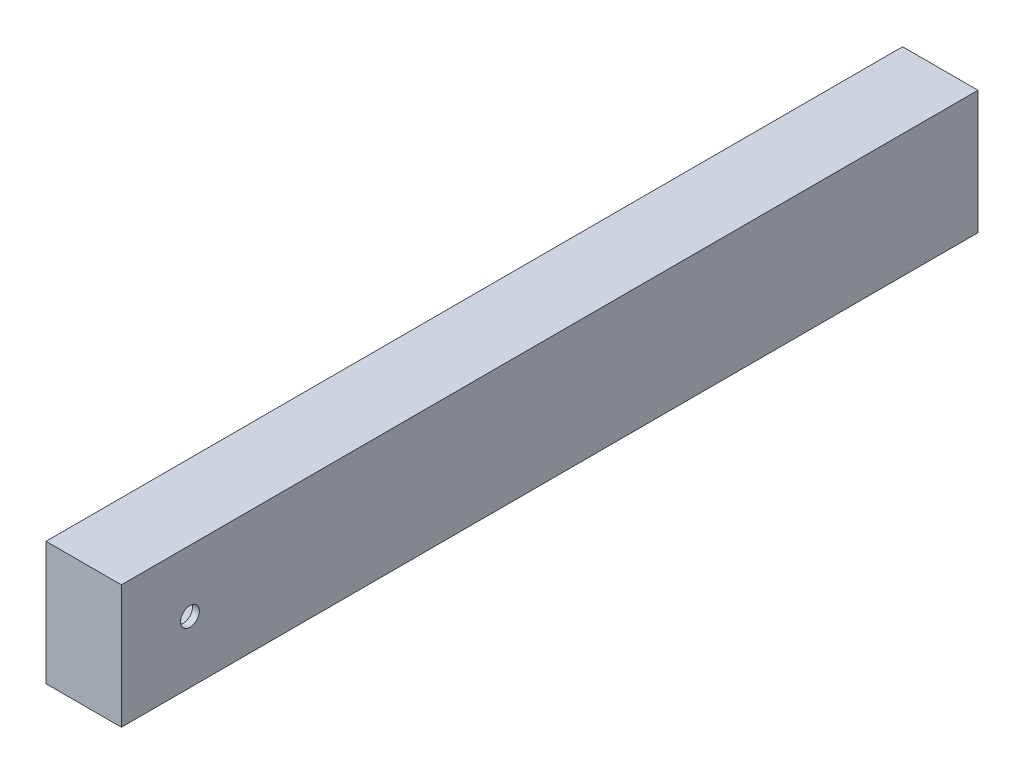
ISO-10303-21;
HEADER;
FILE_DESCRIPTION(('STEP AP214'),'2;1');
FILE_NAME('part.step','',(''),(''),'','','');
FILE_SCHEMA(('AUTOMOTIVE_DESIGN { 1 0 10303 214 1 1 1 1 }'));
ENDSEC;
DATA;
#1=APPLICATION_CONTEXT('core data for automotive mechanical design processes');
#2=APPLICATION_PROTOCOL_DEFINITION('international standard','automotive_design',2000,#1);
#3=PRODUCT_CONTEXT('',#1,'mechanical');
#4=PRODUCT('Part','Part','',(#3));
#5=PRODUCT_RELATED_PRODUCT_CATEGORY('part','',(#4));
#6=PRODUCT_DEFINITION_FORMATION('','',#4);
#7=PRODUCT_DEFINITION_CONTEXT('part definition',#1,'design');
#8=PRODUCT_DEFINITION('design','',#6,#7);
#9=PRODUCT_DEFINITION_SHAPE('','',#8);
#10=(LENGTH_UNIT() NAMED_UNIT(*) SI_UNIT(.MILLI.,.METRE.));
#11=(NAMED_UNIT(*) PLANE_ANGLE_UNIT() SI_UNIT($,.RADIAN.));
#12=(NAMED_UNIT(*) SI_UNIT($,.STERADIAN.) SOLID_ANGLE_UNIT());
#13=UNCERTAINTY_MEASURE_WITH_UNIT(LENGTH_MEASURE(1.E-05),#10,'distance_accuracy_value','');
#14=(GEOMETRIC_REPRESENTATION_CONTEXT(3) GLOBAL_UNCERTAINTY_ASSIGNED_CONTEXT((#13)) GLOBAL_UNIT_ASSIGNED_CONTEXT((#10,
#11,#12)) REPRESENTATION_CONTEXT('',''));
#15=CARTESIAN_POINT('',(0.,0.,0.));
#16=DIRECTION('',(0.,0.,1.));
#17=DIRECTION('',(1.,0.,0.));
#18=AXIS2_PLACEMENT_3D('',#15,#16,#17);
#19=CARTESIAN_POINT('',(0.,0.,250.));
#20=DIRECTION('',(0.,1.,0.));
#21=DIRECTION('',(0.,0.,1.));
#22=AXIS2_PLACEMENT_3D('',#19,#20,#21);
#23=PLANE('',#22);
#24=CARTESIAN_POINT('',(-8.35506227724057E-13,0.,100.));
#25=DIRECTION('',(0.,-1.,0.));
#26=DIRECTION('',(0.,0.,-1.));
#27=AXIS2_PLACEMENT_3D('',#24,#25,#26);
#28=CIRCLE('',#27,5.);
#29=CARTESIAN_POINT('',(-8.35506227724057E-13,0.,95.));
#30=VERTEX_POINT('',#29);
#31=EDGE_CURVE('E232',#30,#30,#28,.T.);
#32=ORIENTED_EDGE('',*,*,#31,.F.);
#33=EDGE_LOOP('',(#32));
#34=FACE_BOUND('',#33,.T.);
#35=CARTESIAN_POINT('',(-2.10713527129735E-13,0.,40.));
#36=DIRECTION('',(0.,-1.,0.));
#37=DIRECTION('',(0.,0.,-1.));
#38=AXIS2_PLACEMENT_3D('',#35,#36,#37);
#39=CIRCLE('',#38,5.);
#40=CARTESIAN_POINT('',(-2.10713527129735E-13,0.,35.));
#41=VERTEX_POINT('',#40);
#42=EDGE_CURVE('E288',#41,#41,#39,.T.);
#43=ORIENTED_EDGE('',*,*,#42,.F.);
#44=EDGE_LOOP('',(#43));
#45=FACE_BOUND('',#44,.T.);
#46=CARTESIAN_POINT('',(0.,0.,20.));
#47=DIRECTION('',(0.,-1.,0.));
#48=DIRECTION('',(0.,0.,-1.));
#49=AXIS2_PLACEMENT_3D('',#46,#47,#48);
#50=CIRCLE('',#49,5.);
#51=CARTESIAN_POINT('',(0.,0.,15.));
#52=VERTEX_POINT('',#51);
#53=EDGE_CURVE('E279',#52,#52,#50,.T.);
#54=ORIENTED_EDGE('',*,*,#53,.F.);
#55=EDGE_LOOP('',(#54));
#56=FACE_BOUND('',#55,.T.);
#57=CARTESIAN_POINT('',(-6.27241994192617E-13,0.,80.));
#58=DIRECTION('',(0.,-1.,0.));
#59=DIRECTION('',(0.,0.,-1.));
#60=AXIS2_PLACEMENT_3D('',#57,#58,#59);
#61=CIRCLE('',#60,5.);
#62=CARTESIAN_POINT('',(-6.27241994192617E-13,0.,75.));
#63=VERTEX_POINT('',#62);
#64=EDGE_CURVE('E273',#63,#63,#61,.T.);
#65=ORIENTED_EDGE('',*,*,#64,.F.);
#66=EDGE_LOOP('',(#65));
#67=FACE_BOUND('',#66,.T.);
#68=CARTESIAN_POINT('',(-4.18977760661176E-13,0.,60.));
#69=DIRECTION('',(0.,-1.,0.));
#70=DIRECTION('',(0.,0.,-1.));
#71=AXIS2_PLACEMENT_3D('',#68,#69,#70);
#72=CIRCLE('',#71,5.);
#73=CARTESIAN_POINT('',(-4.18977760661176E-13,0.,55.));
#74=VERTEX_POINT('',#73);
#75=EDGE_CURVE('E270',#74,#74,#72,.T.);
#76=ORIENTED_EDGE('',*,*,#75,.F.);
#77=EDGE_LOOP('',(#76));
#78=FACE_BOUND('',#77,.T.);
#79=DIRECTION('',(1.,0.,0.));
#80=VECTOR('',#79,1.);
#81=CARTESIAN_POINT('',(0.,0.,0.));
#82=LINE('',#81,#80);
#83=CARTESIAN_POINT('',(-11.,0.,0.));
#84=VERTEX_POINT('',#83);
#85=CARTESIAN_POINT('',(11.,0.,0.));
#86=VERTEX_POINT('',#85);
#87=EDGE_CURVE('E176',#84,#86,#82,.T.);
#88=ORIENTED_EDGE('',*,*,#87,.T.);
#89=DIRECTION('',(0.,0.,-1.));
#90=VECTOR('',#89,1.);
#91=CARTESIAN_POINT('',(11.,0.,250.));
#92=LINE('',#91,#90);
#93=CARTESIAN_POINT('',(11.,0.,250.));
#94=VERTEX_POINT('',#93);
#95=EDGE_CURVE('E77',#94,#86,#92,.T.);
#96=ORIENTED_EDGE('',*,*,#95,.F.);
#97=DIRECTION('',(1.,0.,0.));
#98=VECTOR('',#97,1.);
#99=CARTESIAN_POINT('',(0.,0.,250.));
#100=LINE('',#99,#98);
#101=CARTESIAN_POINT('',(-11.,0.,250.));
#102=VERTEX_POINT('',#101);
#103=EDGE_CURVE('E122',#102,#94,#100,.T.);
#104=ORIENTED_EDGE('',*,*,#103,.F.);
#105=DIRECTION('',(0.,0.,-1.));
#106=VECTOR('',#105,1.);
#107=CARTESIAN_POINT('',(-11.,0.,250.));
#108=LINE('',#107,#106);
#109=EDGE_CURVE('E12',#102,#84,#108,.T.);
#110=ORIENTED_EDGE('',*,*,#109,.T.);
#111=EDGE_LOOP('',(#88,#96,#104,#110));
#112=FACE_BOUND('',#111,.T.);
#113=ADVANCED_FACE('F67',(#34,#45,#56,#67,#78,#112),#23,.F.);
#114=CARTESIAN_POINT('',(11.,0.,250.));
#115=DIRECTION('',(-1.,0.,0.));
#116=DIRECTION('',(0.,-1.,0.));
#117=AXIS2_PLACEMENT_3D('',#114,#115,#116);
#118=PLANE('',#117);
#119=CARTESIAN_POINT('',(11.,18.,230.));
#120=DIRECTION('',(1.,0.,0.));
#121=DIRECTION('',(0.,1.,0.));
#122=AXIS2_PLACEMENT_3D('',#119,#120,#121);
#123=CIRCLE('',#122,2.75000000000001);
#124=CARTESIAN_POINT('',(11.,20.75,230.));
#125=VERTEX_POINT('',#124);
#126=EDGE_CURVE('E298',#125,#125,#123,.T.);
#127=ORIENTED_EDGE('',*,*,#126,.F.);
#128=EDGE_LOOP('',(#127));
#129=FACE_BOUND('',#128,.T.);
#130=DIRECTION('',(0.,1.,0.));
#131=VECTOR('',#130,1.);
#132=CARTESIAN_POINT('',(11.,0.,0.));
#133=LINE('',#132,#131);
#134=CARTESIAN_POINT('',(11.,36.,0.));
#135=VERTEX_POINT('',#134);
#136=EDGE_CURVE('E214',#86,#135,#133,.T.);
#137=ORIENTED_EDGE('',*,*,#136,.T.);
#138=DIRECTION('',(0.,0.,-1.));
#139=VECTOR('',#138,1.);
#140=CARTESIAN_POINT('',(11.,36.,250.));
#141=LINE('',#140,#139);
#142=CARTESIAN_POINT('',(11.,36.,250.));
#143=VERTEX_POINT('',#142);
#144=EDGE_CURVE('E221',#143,#135,#141,.T.);
#145=ORIENTED_EDGE('',*,*,#144,.F.);
#146=DIRECTION('',(0.,1.,0.));
#147=VECTOR('',#146,1.);
#148=CARTESIAN_POINT('',(11.,0.,250.));
#149=LINE('',#148,#147);
#150=EDGE_CURVE('E206',#94,#143,#149,.T.);
#151=ORIENTED_EDGE('',*,*,#150,.F.);
#152=ORIENTED_EDGE('',*,*,#95,.T.);
#153=EDGE_LOOP('',(#137,#145,#151,#152));
#154=FACE_BOUND('',#153,.T.);
#155=ADVANCED_FACE('F321',(#129,#154),#118,.F.);
#156=CARTESIAN_POINT('',(0.,36.,250.));
#157=DIRECTION('',(0.,-1.,0.));
#158=DIRECTION('',(0.,0.,-1.));
#159=AXIS2_PLACEMENT_3D('',#156,#157,#158);
#160=PLANE('',#159);
#161=DIRECTION('',(-1.,0.,0.));
#162=VECTOR('',#161,1.);
#163=CARTESIAN_POINT('',(0.,36.,0.));
#164=LINE('',#163,#162);
#165=CARTESIAN_POINT('',(-11.,36.,0.));
#166=VERTEX_POINT('',#165);
#167=EDGE_CURVE('E115',#135,#166,#164,.T.);
#168=ORIENTED_EDGE('',*,*,#167,.T.);
#169=DIRECTION('',(0.,0.,-1.));
#170=VECTOR('',#169,1.);
#171=CARTESIAN_POINT('',(-11.,36.,250.));
#172=LINE('',#171,#170);
#173=CARTESIAN_POINT('',(-11.,36.,250.));
#174=VERTEX_POINT('',#173);
#175=EDGE_CURVE('E210',#174,#166,#172,.T.);
#176=ORIENTED_EDGE('',*,*,#175,.F.);
#177=DIRECTION('',(-1.,0.,0.));
#178=VECTOR('',#177,1.);
#179=CARTESIAN_POINT('',(0.,36.,250.));
#180=LINE('',#179,#178);
#181=EDGE_CURVE('E94',#143,#174,#180,.T.);
#182=ORIENTED_EDGE('',*,*,#181,.F.);
#183=ORIENTED_EDGE('',*,*,#144,.T.);
#184=EDGE_LOOP('',(#168,#176,#182,#183));
#185=FACE_BOUND('',#184,.T.);
#186=ADVANCED_FACE('F326',(#185),#160,.F.);
#187=CARTESIAN_POINT('',(-11.,0.,250.));
#188=DIRECTION('',(1.,0.,0.));
#189=DIRECTION('',(0.,1.,0.));
#190=AXIS2_PLACEMENT_3D('',#187,#188,#189);
#191=PLANE('',#190);
#192=CARTESIAN_POINT('',(-11.,18.,230.));
#193=DIRECTION('',(1.,0.,0.));
#194=DIRECTION('',(0.,1.,0.));
#195=AXIS2_PLACEMENT_3D('',#192,#193,#194);
#196=CIRCLE('',#195,2.75000000000001);
#197=CARTESIAN_POINT('',(-11.,20.75,230.));
#198=VERTEX_POINT('',#197);
#199=EDGE_CURVE('E274',#198,#198,#196,.T.);
#200=ORIENTED_EDGE('',*,*,#199,.T.);
#201=EDGE_LOOP('',(#200));
#202=FACE_BOUND('',#201,.T.);
#203=DIRECTION('',(0.,-1.,0.));
#204=VECTOR('',#203,1.);
#205=CARTESIAN_POINT('',(-11.,0.,0.));
#206=LINE('',#205,#204);
#207=EDGE_CURVE('E170',#166,#84,#206,.T.);
#208=ORIENTED_EDGE('',*,*,#207,.T.);
#209=ORIENTED_EDGE('',*,*,#109,.F.);
#210=DIRECTION('',(0.,-1.,0.));
#211=VECTOR('',#210,1.);
#212=CARTESIAN_POINT('',(-11.,0.,250.));
#213=LINE('',#212,#211);
#214=EDGE_CURVE('E201',#174,#102,#213,.T.);
#215=ORIENTED_EDGE('',*,*,#214,.F.);
#216=ORIENTED_EDGE('',*,*,#175,.T.);
#217=EDGE_LOOP('',(#208,#209,#215,#216));
#218=FACE_BOUND('',#217,.T.);
#219=ADVANCED_FACE('F69',(#202,#218),#191,.F.);
#220=CARTESIAN_POINT('',(0.,0.,0.));
#221=DIRECTION('',(0.,0.,1.));
#222=DIRECTION('',(1.,0.,0.));
#223=AXIS2_PLACEMENT_3D('',#220,#221,#222);
#224=PLANE('',#223);
#225=DIRECTION('',(-1.,0.,0.));
#226=VECTOR('',#225,1.);
#227=CARTESIAN_POINT('',(0.,34.,0.));
#228=LINE('',#227,#226);
#229=CARTESIAN_POINT('',(9.,34.,0.));
#230=VERTEX_POINT('',#229);
#231=CARTESIAN_POINT('',(-9.,34.,0.));
#232=VERTEX_POINT('',#231);
#233=EDGE_CURVE('E164',#230,#232,#228,.T.);
#234=ORIENTED_EDGE('',*,*,#233,.T.);
#235=DIRECTION('',(0.,-1.,0.));
#236=VECTOR('',#235,1.);
#237=CARTESIAN_POINT('',(-9.,0.,0.));
#238=LINE('',#237,#236);
#239=CARTESIAN_POINT('',(-9.,2.,0.));
#240=VERTEX_POINT('',#239);
#241=EDGE_CURVE('E192',#232,#240,#238,.T.);
#242=ORIENTED_EDGE('',*,*,#241,.T.);
#243=DIRECTION('',(1.,0.,0.));
#244=VECTOR('',#243,1.);
#245=CARTESIAN_POINT('',(0.,2.,0.));
#246=LINE('',#245,#244);
#247=CARTESIAN_POINT('',(9.,2.,0.));
#248=VERTEX_POINT('',#247);
#249=EDGE_CURVE('E168',#240,#248,#246,.T.);
#250=ORIENTED_EDGE('',*,*,#249,.T.);
#251=DIRECTION('',(0.,1.,0.));
#252=VECTOR('',#251,1.);
#253=CARTESIAN_POINT('',(9.,0.,0.));
#254=LINE('',#253,#252);
#255=EDGE_CURVE('E85',#248,#230,#254,.T.);
#256=ORIENTED_EDGE('',*,*,#255,.T.);
#257=EDGE_LOOP('',(#234,#242,#250,#256));
#258=FACE_BOUND('',#257,.T.);
#259=ORIENTED_EDGE('',*,*,#207,.F.);
#260=ORIENTED_EDGE('',*,*,#167,.F.);
#261=ORIENTED_EDGE('',*,*,#136,.F.);
#262=ORIENTED_EDGE('',*,*,#87,.F.);
#263=EDGE_LOOP('',(#259,#260,#261,#262));
#264=FACE_BOUND('',#263,.T.);
#265=ADVANCED_FACE('F334',(#258,#264),#224,.F.);
#266=CARTESIAN_POINT('',(0.,0.,250.));
#267=DIRECTION('',(0.,0.,1.));
#268=DIRECTION('',(1.,0.,0.));
#269=AXIS2_PLACEMENT_3D('',#266,#267,#268);
#270=PLANE('',#269);
#271=ORIENTED_EDGE('',*,*,#214,.T.);
#272=ORIENTED_EDGE('',*,*,#103,.T.);
#273=ORIENTED_EDGE('',*,*,#150,.T.);
#274=ORIENTED_EDGE('',*,*,#181,.T.);
#275=EDGE_LOOP('',(#271,#272,#273,#274));
#276=FACE_BOUND('',#275,.T.);
#277=ADVANCED_FACE('F253',(#276),#270,.T.);
#278=CARTESIAN_POINT('',(0.,2.,250.));
#279=DIRECTION('',(0.,1.,0.));
#280=DIRECTION('',(0.,0.,1.));
#281=AXIS2_PLACEMENT_3D('',#278,#279,#280);
#282=PLANE('',#281);
#283=CARTESIAN_POINT('',(-8.35506227724057E-13,2.,100.));
#284=DIRECTION('',(0.,1.,0.));
#285=DIRECTION('',(0.,0.,1.));
#286=AXIS2_PLACEMENT_3D('',#283,#284,#285);
#287=CIRCLE('',#286,5.);
#288=CARTESIAN_POINT('',(-8.35506227724057E-13,2.,105.));
#289=VERTEX_POINT('',#288);
#290=EDGE_CURVE('E195',#289,#289,#287,.T.);
#291=ORIENTED_EDGE('',*,*,#290,.F.);
#292=EDGE_LOOP('',(#291));
#293=FACE_BOUND('',#292,.T.);
#294=CARTESIAN_POINT('',(-2.10713527129735E-13,2.,40.));
#295=DIRECTION('',(0.,1.,0.));
#296=DIRECTION('',(0.,0.,1.));
#297=AXIS2_PLACEMENT_3D('',#294,#295,#296);
#298=CIRCLE('',#297,5.);
#299=CARTESIAN_POINT('',(-2.10713527129735E-13,2.,45.));
#300=VERTEX_POINT('',#299);
#301=EDGE_CURVE('E240',#300,#300,#298,.T.);
#302=ORIENTED_EDGE('',*,*,#301,.F.);
#303=EDGE_LOOP('',(#302));
#304=FACE_BOUND('',#303,.T.);
#305=CARTESIAN_POINT('',(0.,2.,20.));
#306=DIRECTION('',(0.,1.,0.));
#307=DIRECTION('',(0.,0.,1.));
#308=AXIS2_PLACEMENT_3D('',#305,#306,#307);
#309=CIRCLE('',#308,5.);
#310=CARTESIAN_POINT('',(0.,2.,25.));
#311=VERTEX_POINT('',#310);
#312=EDGE_CURVE('E236',#311,#311,#309,.T.);
#313=ORIENTED_EDGE('',*,*,#312,.F.);
#314=EDGE_LOOP('',(#313));
#315=FACE_BOUND('',#314,.T.);
#316=CARTESIAN_POINT('',(-6.27241994192617E-13,2.,80.));
#317=DIRECTION('',(0.,1.,0.));
#318=DIRECTION('',(0.,0.,1.));
#319=AXIS2_PLACEMENT_3D('',#316,#317,#318);
#320=CIRCLE('',#319,5.);
#321=CARTESIAN_POINT('',(-6.27241994192617E-13,2.,85.));
#322=VERTEX_POINT('',#321);
#323=EDGE_CURVE('E231',#322,#322,#320,.T.);
#324=ORIENTED_EDGE('',*,*,#323,.F.);
#325=EDGE_LOOP('',(#324));
#326=FACE_BOUND('',#325,.T.);
#327=CARTESIAN_POINT('',(-4.18977760661176E-13,2.,60.));
#328=DIRECTION('',(0.,1.,0.));
#329=DIRECTION('',(0.,0.,1.));
#330=AXIS2_PLACEMENT_3D('',#327,#328,#329);
#331=CIRCLE('',#330,5.);
#332=CARTESIAN_POINT('',(-4.18977760661176E-13,2.,65.));
#333=VERTEX_POINT('',#332);
#334=EDGE_CURVE('E227',#333,#333,#331,.T.);
#335=ORIENTED_EDGE('',*,*,#334,.F.);
#336=EDGE_LOOP('',(#335));
#337=FACE_BOUND('',#336,.T.);
#338=ORIENTED_EDGE('',*,*,#249,.F.);
#339=DIRECTION('',(0.,0.,-1.));
#340=VECTOR('',#339,1.);
#341=CARTESIAN_POINT('',(-9.,2.,250.));
#342=LINE('',#341,#340);
#343=CARTESIAN_POINT('',(-9.,2.,248.));
#344=VERTEX_POINT('',#343);
#345=EDGE_CURVE('E160',#344,#240,#342,.T.);
#346=ORIENTED_EDGE('',*,*,#345,.F.);
#347=DIRECTION('',(1.,0.,0.));
#348=VECTOR('',#347,1.);
#349=CARTESIAN_POINT('',(0.,2.,248.));
#350=LINE('',#349,#348);
#351=CARTESIAN_POINT('',(9.,2.,248.));
#352=VERTEX_POINT('',#351);
#353=EDGE_CURVE('E145',#344,#352,#350,.T.);
#354=ORIENTED_EDGE('',*,*,#353,.T.);
#355=DIRECTION('',(0.,0.,-1.));
#356=VECTOR('',#355,1.);
#357=CARTESIAN_POINT('',(9.,2.,250.));
#358=LINE('',#357,#356);
#359=EDGE_CURVE('E171',#352,#248,#358,.T.);
#360=ORIENTED_EDGE('',*,*,#359,.T.);
#361=EDGE_LOOP('',(#338,#346,#354,#360));
#362=FACE_BOUND('',#361,.T.);
#363=ADVANCED_FACE('F166',(#293,#304,#315,#326,#337,#362),#282,.T.);
#364=CARTESIAN_POINT('',(9.,0.,250.));
#365=DIRECTION('',(-1.,0.,0.));
#366=DIRECTION('',(0.,-1.,0.));
#367=AXIS2_PLACEMENT_3D('',#364,#365,#366);
#368=PLANE('',#367);
#369=CARTESIAN_POINT('',(9.,18.,230.));
#370=DIRECTION('',(-1.,0.,0.));
#371=DIRECTION('',(0.,-1.,0.));
#372=AXIS2_PLACEMENT_3D('',#369,#370,#371);
#373=CIRCLE('',#372,2.75000000000001);
#374=CARTESIAN_POINT('',(9.,15.25,230.));
#375=VERTEX_POINT('',#374);
#376=EDGE_CURVE('E282',#375,#375,#373,.T.);
#377=ORIENTED_EDGE('',*,*,#376,.F.);
#378=EDGE_LOOP('',(#377));
#379=FACE_BOUND('',#378,.T.);
#380=ORIENTED_EDGE('',*,*,#255,.F.);
#381=ORIENTED_EDGE('',*,*,#359,.F.);
#382=DIRECTION('',(0.,1.,0.));
#383=VECTOR('',#382,1.);
#384=CARTESIAN_POINT('',(9.,0.,248.));
#385=LINE('',#384,#383);
#386=CARTESIAN_POINT('',(9.,34.,248.));
#387=VERTEX_POINT('',#386);
#388=EDGE_CURVE('E150',#352,#387,#385,.T.);
#389=ORIENTED_EDGE('',*,*,#388,.T.);
#390=DIRECTION('',(0.,0.,-1.));
#391=VECTOR('',#390,1.);
#392=CARTESIAN_POINT('',(9.,34.,250.));
#393=LINE('',#392,#391);
#394=EDGE_CURVE('E178',#387,#230,#393,.T.);
#395=ORIENTED_EDGE('',*,*,#394,.T.);
#396=EDGE_LOOP('',(#380,#381,#389,#395));
#397=FACE_BOUND('',#396,.T.);
#398=ADVANCED_FACE('F252',(#379,#397),#368,.T.);
#399=CARTESIAN_POINT('',(0.,34.,250.));
#400=DIRECTION('',(0.,-1.,0.));
#401=DIRECTION('',(0.,0.,-1.));
#402=AXIS2_PLACEMENT_3D('',#399,#400,#401);
#403=PLANE('',#402);
#404=ORIENTED_EDGE('',*,*,#233,.F.);
#405=ORIENTED_EDGE('',*,*,#394,.F.);
#406=DIRECTION('',(-1.,0.,0.));
#407=VECTOR('',#406,1.);
#408=CARTESIAN_POINT('',(0.,34.,248.));
#409=LINE('',#408,#407);
#410=CARTESIAN_POINT('',(-9.,34.,248.));
#411=VERTEX_POINT('',#410);
#412=EDGE_CURVE('E185',#387,#411,#409,.T.);
#413=ORIENTED_EDGE('',*,*,#412,.T.);
#414=DIRECTION('',(0.,0.,-1.));
#415=VECTOR('',#414,1.);
#416=CARTESIAN_POINT('',(-9.,34.,250.));
#417=LINE('',#416,#415);
#418=EDGE_CURVE('E162',#411,#232,#417,.T.);
#419=ORIENTED_EDGE('',*,*,#418,.T.);
#420=EDGE_LOOP('',(#404,#405,#413,#419));
#421=FACE_BOUND('',#420,.T.);
#422=ADVANCED_FACE('F311',(#421),#403,.T.);
#423=CARTESIAN_POINT('',(-9.,0.,250.));
#424=DIRECTION('',(1.,0.,0.));
#425=DIRECTION('',(0.,1.,0.));
#426=AXIS2_PLACEMENT_3D('',#423,#424,#425);
#427=PLANE('',#426);
#428=CARTESIAN_POINT('',(-9.,18.,230.));
#429=DIRECTION('',(1.,0.,0.));
#430=DIRECTION('',(0.,1.,0.));
#431=AXIS2_PLACEMENT_3D('',#428,#429,#430);
#432=CIRCLE('',#431,2.75000000000001);
#433=CARTESIAN_POINT('',(-9.,20.75,230.));
#434=VERTEX_POINT('',#433);
#435=EDGE_CURVE('E71',#434,#434,#432,.T.);
#436=ORIENTED_EDGE('',*,*,#435,.F.);
#437=EDGE_LOOP('',(#436));
#438=FACE_BOUND('',#437,.T.);
#439=ORIENTED_EDGE('',*,*,#241,.F.);
#440=ORIENTED_EDGE('',*,*,#418,.F.);
#441=DIRECTION('',(0.,-1.,0.));
#442=VECTOR('',#441,1.);
#443=CARTESIAN_POINT('',(-9.,0.,248.));
#444=LINE('',#443,#442);
#445=EDGE_CURVE('E149',#411,#344,#444,.T.);
#446=ORIENTED_EDGE('',*,*,#445,.T.);
#447=ORIENTED_EDGE('',*,*,#345,.T.);
#448=EDGE_LOOP('',(#439,#440,#446,#447));
#449=FACE_BOUND('',#448,.T.);
#450=ADVANCED_FACE('F159',(#438,#449),#427,.T.);
#451=CARTESIAN_POINT('',(0.,0.,248.));
#452=DIRECTION('',(0.,0.,1.));
#453=DIRECTION('',(1.,0.,0.));
#454=AXIS2_PLACEMENT_3D('',#451,#452,#453);
#455=PLANE('',#454);
#456=ORIENTED_EDGE('',*,*,#445,.F.);
#457=ORIENTED_EDGE('',*,*,#412,.F.);
#458=ORIENTED_EDGE('',*,*,#388,.F.);
#459=ORIENTED_EDGE('',*,*,#353,.F.);
#460=EDGE_LOOP('',(#456,#457,#458,#459));
#461=FACE_BOUND('',#460,.T.);
#462=ADVANCED_FACE('F147',(#461),#455,.F.);
#463=CARTESIAN_POINT('',(-4.18977760661176E-13,10.,60.));
#464=DIRECTION('',(0.,-1.,0.));
#465=DIRECTION('',(0.,0.,-1.));
#466=AXIS2_PLACEMENT_3D('',#463,#464,#465);
#467=CYLINDRICAL_SURFACE('',#466,5.);
#468=ORIENTED_EDGE('',*,*,#334,.T.);
#469=EDGE_LOOP('',(#468));
#470=FACE_BOUND('',#469,.T.);
#471=ORIENTED_EDGE('',*,*,#75,.T.);
#472=EDGE_LOOP('',(#471));
#473=FACE_BOUND('',#472,.T.);
#474=ADVANCED_FACE('F263',(#470,#473),#467,.F.);
#475=CARTESIAN_POINT('',(-6.27241994192617E-13,10.,80.));
#476=DIRECTION('',(0.,-1.,0.));
#477=DIRECTION('',(0.,0.,-1.));
#478=AXIS2_PLACEMENT_3D('',#475,#476,#477);
#479=CYLINDRICAL_SURFACE('',#478,5.);
#480=ORIENTED_EDGE('',*,*,#323,.T.);
#481=EDGE_LOOP('',(#480));
#482=FACE_BOUND('',#481,.T.);
#483=ORIENTED_EDGE('',*,*,#64,.T.);
#484=EDGE_LOOP('',(#483));
#485=FACE_BOUND('',#484,.T.);
#486=ADVANCED_FACE('F266',(#482,#485),#479,.F.);
#487=CARTESIAN_POINT('',(0.,10.,20.));
#488=DIRECTION('',(0.,-1.,0.));
#489=DIRECTION('',(0.,0.,-1.));
#490=AXIS2_PLACEMENT_3D('',#487,#488,#489);
#491=CYLINDRICAL_SURFACE('',#490,5.);
#492=ORIENTED_EDGE('',*,*,#312,.T.);
#493=EDGE_LOOP('',(#492));
#494=FACE_BOUND('',#493,.T.);
#495=ORIENTED_EDGE('',*,*,#53,.T.);
#496=EDGE_LOOP('',(#495));
#497=FACE_BOUND('',#496,.T.);
#498=ADVANCED_FACE('F368',(#494,#497),#491,.F.);
#499=CARTESIAN_POINT('',(-2.10713527129735E-13,10.,40.));
#500=DIRECTION('',(0.,-1.,0.));
#501=DIRECTION('',(0.,0.,-1.));
#502=AXIS2_PLACEMENT_3D('',#499,#500,#501);
#503=CYLINDRICAL_SURFACE('',#502,5.);
#504=ORIENTED_EDGE('',*,*,#301,.T.);
#505=EDGE_LOOP('',(#504));
#506=FACE_BOUND('',#505,.T.);
#507=ORIENTED_EDGE('',*,*,#42,.T.);
#508=EDGE_LOOP('',(#507));
#509=FACE_BOUND('',#508,.T.);
#510=ADVANCED_FACE('F363',(#506,#509),#503,.F.);
#511=CARTESIAN_POINT('',(-8.35506227724057E-13,10.,100.));
#512=DIRECTION('',(0.,-1.,0.));
#513=DIRECTION('',(0.,0.,-1.));
#514=AXIS2_PLACEMENT_3D('',#511,#512,#513);
#515=CYLINDRICAL_SURFACE('',#514,5.);
#516=ORIENTED_EDGE('',*,*,#290,.T.);
#517=EDGE_LOOP('',(#516));
#518=FACE_BOUND('',#517,.T.);
#519=ORIENTED_EDGE('',*,*,#31,.T.);
#520=EDGE_LOOP('',(#519));
#521=FACE_BOUND('',#520,.T.);
#522=ADVANCED_FACE('F247',(#518,#521),#515,.F.);
#523=CARTESIAN_POINT('',(-18.,18.,230.));
#524=DIRECTION('',(1.,0.,0.));
#525=DIRECTION('',(0.,1.,0.));
#526=AXIS2_PLACEMENT_3D('',#523,#524,#525);
#527=CYLINDRICAL_SURFACE('',#526,2.75000000000001);
#528=ORIENTED_EDGE('',*,*,#435,.T.);
#529=EDGE_LOOP('',(#528));
#530=FACE_BOUND('',#529,.T.);
#531=ORIENTED_EDGE('',*,*,#199,.F.);
#532=EDGE_LOOP('',(#531));
#533=FACE_BOUND('',#532,.T.);
#534=ADVANCED_FACE('F307',(#530,#533),#527,.F.);
#535=ORIENTED_EDGE('',*,*,#376,.T.);
#536=EDGE_LOOP('',(#535));
#537=FACE_BOUND('',#536,.T.);
#538=ORIENTED_EDGE('',*,*,#126,.T.);
#539=EDGE_LOOP('',(#538));
#540=FACE_BOUND('',#539,.T.);
#541=ADVANCED_FACE('F356',(#537,#540),#527,.F.);
#542=CLOSED_SHELL('',(#113,#155,#186,#219,#265,#277,#363,#398,#422,#450,#462,#474,#486,#498,
#510,#522,#534,#541));
#543=MANIFOLD_SOLID_BREP('B2',#542);
#544=ADVANCED_BREP_SHAPE_REPRESENTATION('',(#18,#543),#14);
#545=SHAPE_DEFINITION_REPRESENTATION(#9,#544);
ENDSEC;
END-ISO-10303-21;
